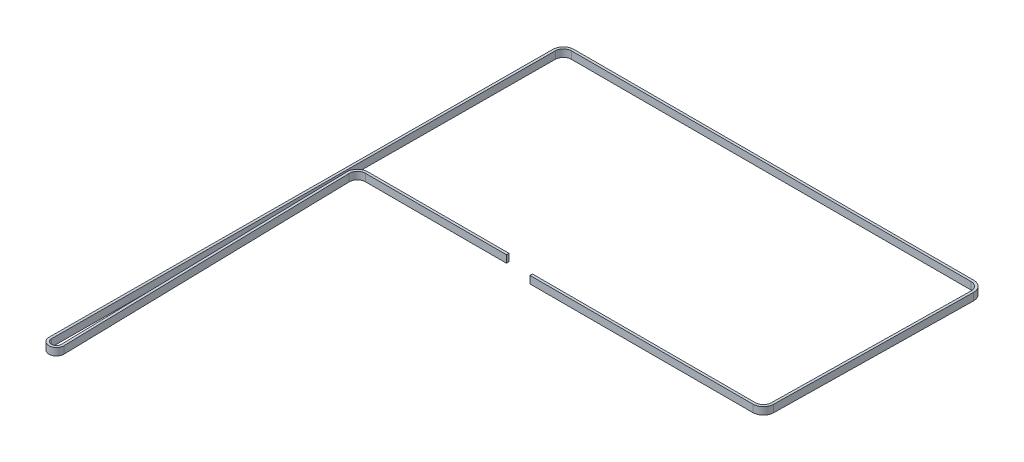
ISO-10303-21;
HEADER;
FILE_DESCRIPTION(('STEP AP214'),'2;1');
FILE_NAME('part.step','',(''),(''),'','','');
FILE_SCHEMA(('AUTOMOTIVE_DESIGN { 1 0 10303 214 1 1 1 1 }'));
ENDSEC;
DATA;
#1=APPLICATION_CONTEXT('core data for automotive mechanical design processes');
#2=APPLICATION_PROTOCOL_DEFINITION('international standard','automotive_design',2000,#1);
#3=PRODUCT_CONTEXT('',#1,'mechanical');
#4=PRODUCT('Part','Part','',(#3));
#5=PRODUCT_RELATED_PRODUCT_CATEGORY('part','',(#4));
#6=PRODUCT_DEFINITION_FORMATION('','',#4);
#7=PRODUCT_DEFINITION_CONTEXT('part definition',#1,'design');
#8=PRODUCT_DEFINITION('design','',#6,#7);
#9=PRODUCT_DEFINITION_SHAPE('','',#8);
#10=(LENGTH_UNIT() NAMED_UNIT(*) SI_UNIT(.MILLI.,.METRE.));
#11=(NAMED_UNIT(*) PLANE_ANGLE_UNIT() SI_UNIT($,.RADIAN.));
#12=(NAMED_UNIT(*) SI_UNIT($,.STERADIAN.) SOLID_ANGLE_UNIT());
#13=UNCERTAINTY_MEASURE_WITH_UNIT(LENGTH_MEASURE(1.E-05),#10,'distance_accuracy_value','');
#14=(GEOMETRIC_REPRESENTATION_CONTEXT(3) GLOBAL_UNCERTAINTY_ASSIGNED_CONTEXT((#13)) GLOBAL_UNIT_ASSIGNED_CONTEXT((#10,
#11,#12)) REPRESENTATION_CONTEXT('',''));
#15=CARTESIAN_POINT('',(0.,0.,0.));
#16=DIRECTION('',(0.,0.,1.));
#17=DIRECTION('',(1.,0.,0.));
#18=AXIS2_PLACEMENT_3D('',#15,#16,#17);
#19=CARTESIAN_POINT('',(159.500009042404,500.,-17.0773660537626));
#20=DIRECTION('',(0.,0.,-1.));
#21=DIRECTION('',(0.,1.,0.));
#22=AXIS2_PLACEMENT_3D('',#19,#20,#21);
#23=PLANE('',#22);
#24=DIRECTION('',(-1.,0.,0.));
#25=VECTOR('',#24,1.);
#26=CARTESIAN_POINT('',(159.500009042404,506.,-17.0773660537626));
#27=LINE('',#26,#25);
#28=CARTESIAN_POINT('',(159.500009042404,506.,-17.0773660537626));
#29=VERTEX_POINT('',#28);
#30=CARTESIAN_POINT('',(-21.1924852746072,506.,-17.0773660537626));
#31=VERTEX_POINT('',#30);
#32=EDGE_CURVE('E224',#29,#31,#27,.T.);
#33=ORIENTED_EDGE('',*,*,#32,.T.);
#34=DIRECTION('',(0.,1.,0.));
#35=VECTOR('',#34,1.);
#36=CARTESIAN_POINT('',(-21.1924852746072,500.,-17.0773660537626));
#37=LINE('',#36,#35);
#38=CARTESIAN_POINT('',(-21.1924852746072,500.,-17.0773660537626));
#39=VERTEX_POINT('',#38);
#40=EDGE_CURVE('E11',#39,#31,#37,.T.);
#41=ORIENTED_EDGE('',*,*,#40,.F.);
#42=DIRECTION('',(-1.,0.,0.));
#43=VECTOR('',#42,1.);
#44=CARTESIAN_POINT('',(159.500009042404,500.,-17.0773660537626));
#45=LINE('',#44,#43);
#46=CARTESIAN_POINT('',(159.500009042404,500.,-17.0773660537626));
#47=VERTEX_POINT('',#46);
#48=EDGE_CURVE('E137',#47,#39,#45,.T.);
#49=ORIENTED_EDGE('',*,*,#48,.F.);
#50=DIRECTION('',(0.,1.,0.));
#51=VECTOR('',#50,1.);
#52=CARTESIAN_POINT('',(159.500009042404,500.,-17.0773660537626));
#53=LINE('',#52,#51);
#54=EDGE_CURVE('E220',#47,#29,#53,.T.);
#55=ORIENTED_EDGE('',*,*,#54,.T.);
#56=EDGE_LOOP('',(#33,#41,#49,#55));
#57=FACE_BOUND('',#56,.T.);
#58=ADVANCED_FACE('F33',(#57),#23,.F.);
#59=CARTESIAN_POINT('',(-21.1924852746072,500.,-19.0773660537626));
#60=DIRECTION('',(-1.,0.,0.));
#61=DIRECTION('',(0.,0.,1.));
#62=AXIS2_PLACEMENT_3D('',#59,#60,#61);
#63=PLANE('',#62);
#64=DIRECTION('',(0.,0.,1.));
#65=VECTOR('',#64,1.);
#66=CARTESIAN_POINT('',(-21.1924852746072,506.,-19.0773660537626));
#67=LINE('',#66,#65);
#68=CARTESIAN_POINT('',(-21.1924852746072,506.,-19.0773660537626));
#69=VERTEX_POINT('',#68);
#70=EDGE_CURVE('E227',#69,#31,#67,.T.);
#71=ORIENTED_EDGE('',*,*,#70,.F.);
#72=DIRECTION('',(0.,1.,0.));
#73=VECTOR('',#72,1.);
#74=CARTESIAN_POINT('',(-21.1924852746072,500.,-19.0773660537626));
#75=LINE('',#74,#73);
#76=CARTESIAN_POINT('',(-21.1924852746072,500.,-19.0773660537626));
#77=VERTEX_POINT('',#76);
#78=EDGE_CURVE('E41',#77,#69,#75,.T.);
#79=ORIENTED_EDGE('',*,*,#78,.F.);
#80=DIRECTION('',(0.,0.,1.));
#81=VECTOR('',#80,1.);
#82=CARTESIAN_POINT('',(-21.1924852746072,500.,-19.0773660537626));
#83=LINE('',#82,#81);
#84=EDGE_CURVE('E349',#77,#39,#83,.T.);
#85=ORIENTED_EDGE('',*,*,#84,.T.);
#86=ORIENTED_EDGE('',*,*,#40,.T.);
#87=EDGE_LOOP('',(#71,#79,#85,#86));
#88=FACE_BOUND('',#87,.T.);
#89=ADVANCED_FACE('F336',(#88),#63,.T.);
#90=CARTESIAN_POINT('',(159.500009042404,500.,-19.0773660537626));
#91=DIRECTION('',(0.,0.,-1.));
#92=DIRECTION('',(0.,1.,0.));
#93=AXIS2_PLACEMENT_3D('',#90,#91,#92);
#94=PLANE('',#93);
#95=DIRECTION('',(-1.,0.,0.));
#96=VECTOR('',#95,1.);
#97=CARTESIAN_POINT('',(159.500009042404,506.,-19.0773660537626));
#98=LINE('',#97,#96);
#99=CARTESIAN_POINT('',(159.500009042404,506.,-19.0773660537626));
#100=VERTEX_POINT('',#99);
#101=EDGE_CURVE('E230',#100,#69,#98,.T.);
#102=ORIENTED_EDGE('',*,*,#101,.F.);
#103=DIRECTION('',(0.,1.,0.));
#104=VECTOR('',#103,1.);
#105=CARTESIAN_POINT('',(159.500009042404,500.,-19.0773660537626));
#106=LINE('',#105,#104);
#107=CARTESIAN_POINT('',(159.500009042404,500.,-19.0773660537626));
#108=VERTEX_POINT('',#107);
#109=EDGE_CURVE('E326',#108,#100,#106,.T.);
#110=ORIENTED_EDGE('',*,*,#109,.F.);
#111=DIRECTION('',(-1.,0.,0.));
#112=VECTOR('',#111,1.);
#113=CARTESIAN_POINT('',(159.500009042404,500.,-19.0773660537626));
#114=LINE('',#113,#112);
#115=EDGE_CURVE('E333',#108,#77,#114,.T.);
#116=ORIENTED_EDGE('',*,*,#115,.T.);
#117=ORIENTED_EDGE('',*,*,#78,.T.);
#118=EDGE_LOOP('',(#102,#110,#116,#117));
#119=FACE_BOUND('',#118,.T.);
#120=ADVANCED_FACE('F331',(#119),#94,.T.);
#121=CARTESIAN_POINT('',(159.500009042404,500.,-25.5773660537626));
#122=DIRECTION('',(0.,1.,0.));
#123=DIRECTION('',(-1.,0.,0.));
#124=AXIS2_PLACEMENT_3D('',#121,#122,#123);
#125=CYLINDRICAL_SURFACE('',#124,6.50000000000001);
#126=CARTESIAN_POINT('',(159.500009042404,506.,-25.5773660537626));
#127=DIRECTION('',(0.,-1.,0.));
#128=DIRECTION('',(1.,0.,0.));
#129=AXIS2_PLACEMENT_3D('',#126,#127,#128);
#130=CIRCLE('',#129,6.50000000000001);
#131=CARTESIAN_POINT('',(165.999209980939,506.,-25.4754486335334));
#132=VERTEX_POINT('',#131);
#133=EDGE_CURVE('E233',#132,#100,#130,.T.);
#134=ORIENTED_EDGE('',*,*,#133,.F.);
#135=DIRECTION('',(0.,1.,0.));
#136=VECTOR('',#135,1.);
#137=CARTESIAN_POINT('',(165.999209980939,500.,-25.4754486335335));
#138=LINE('',#137,#136);
#139=CARTESIAN_POINT('',(165.999209980939,500.,-25.4754486335335));
#140=VERTEX_POINT('',#139);
#141=EDGE_CURVE('E324',#140,#132,#138,.T.);
#142=ORIENTED_EDGE('',*,*,#141,.F.);
#143=CARTESIAN_POINT('',(159.500009042404,500.,-25.5773660537626));
#144=DIRECTION('',(0.,-1.,0.));
#145=DIRECTION('',(1.,0.,0.));
#146=AXIS2_PLACEMENT_3D('',#143,#144,#145);
#147=CIRCLE('',#146,6.50000000000001);
#148=EDGE_CURVE('E346',#140,#108,#147,.T.);
#149=ORIENTED_EDGE('',*,*,#148,.T.);
#150=ORIENTED_EDGE('',*,*,#109,.T.);
#151=EDGE_LOOP('',(#134,#142,#149,#150));
#152=FACE_BOUND('',#151,.T.);
#153=ADVANCED_FACE('F343',(#152),#125,.F.);
#154=CARTESIAN_POINT('',(168.499200930835,500.,-184.898082088762));
#155=DIRECTION('',(-0.999877067466918,0.,-0.0156796031121782));
#156=DIRECTION('',(-0.0156796031121782,0.,0.999877067466919));
#157=AXIS2_PLACEMENT_3D('',#154,#155,#156);
#158=PLANE('',#157);
#159=DIRECTION('',(-0.0156796031121782,0.,0.999877067466919));
#160=VECTOR('',#159,1.);
#161=CARTESIAN_POINT('',(168.499200930835,506.,-184.898082088762));
#162=LINE('',#161,#160);
#163=CARTESIAN_POINT('',(168.499200930835,506.,-184.898082088762));
#164=VERTEX_POINT('',#163);
#165=EDGE_CURVE('E236',#164,#132,#162,.T.);
#166=ORIENTED_EDGE('',*,*,#165,.F.);
#167=DIRECTION('',(0.,1.,0.));
#168=VECTOR('',#167,1.);
#169=CARTESIAN_POINT('',(168.499200930835,500.,-184.898082088762));
#170=LINE('',#169,#168);
#171=CARTESIAN_POINT('',(168.499200930835,500.,-184.898082088762));
#172=VERTEX_POINT('',#171);
#173=EDGE_CURVE('E322',#172,#164,#170,.T.);
#174=ORIENTED_EDGE('',*,*,#173,.F.);
#175=DIRECTION('',(-0.0156796031121782,0.,0.999877067466919));
#176=VECTOR('',#175,1.);
#177=CARTESIAN_POINT('',(168.499200930835,500.,-184.898082088762));
#178=LINE('',#177,#176);
#179=EDGE_CURVE('E351',#172,#140,#178,.T.);
#180=ORIENTED_EDGE('',*,*,#179,.T.);
#181=ORIENTED_EDGE('',*,*,#141,.T.);
#182=EDGE_LOOP('',(#166,#174,#180,#181));
#183=FACE_BOUND('',#182,.T.);
#184=ADVANCED_FACE('F427',(#183),#158,.T.);
#185=CARTESIAN_POINT('',(162.,500.,-185.));
#186=DIRECTION('',(0.,1.,0.));
#187=DIRECTION('',(-1.,0.,0.));
#188=AXIS2_PLACEMENT_3D('',#185,#186,#187);
#189=CYLINDRICAL_SURFACE('',#188,6.49999999999997);
#190=CARTESIAN_POINT('',(162.,506.,-185.));
#191=DIRECTION('',(0.,-1.,0.));
#192=DIRECTION('',(1.,0.,0.));
#193=AXIS2_PLACEMENT_3D('',#190,#191,#192);
#194=CIRCLE('',#193,6.49999999999997);
#195=CARTESIAN_POINT('',(162.,506.,-191.5));
#196=VERTEX_POINT('',#195);
#197=EDGE_CURVE('E239',#196,#164,#194,.T.);
#198=ORIENTED_EDGE('',*,*,#197,.F.);
#199=DIRECTION('',(0.,1.,0.));
#200=VECTOR('',#199,1.);
#201=CARTESIAN_POINT('',(162.,500.,-191.5));
#202=LINE('',#201,#200);
#203=CARTESIAN_POINT('',(162.,500.,-191.5));
#204=VERTEX_POINT('',#203);
#205=EDGE_CURVE('E320',#204,#196,#202,.T.);
#206=ORIENTED_EDGE('',*,*,#205,.F.);
#207=CARTESIAN_POINT('',(162.,500.,-185.));
#208=DIRECTION('',(0.,-1.,0.));
#209=DIRECTION('',(1.,0.,0.));
#210=AXIS2_PLACEMENT_3D('',#207,#208,#209);
#211=CIRCLE('',#210,6.49999999999997);
#212=EDGE_CURVE('E357',#204,#172,#211,.T.);
#213=ORIENTED_EDGE('',*,*,#212,.T.);
#214=ORIENTED_EDGE('',*,*,#173,.T.);
#215=EDGE_LOOP('',(#198,#206,#213,#214));
#216=FACE_BOUND('',#215,.T.);
#217=ADVANCED_FACE('F430',(#216),#189,.F.);
#218=CARTESIAN_POINT('',(-162.,500.,-191.5));
#219=DIRECTION('',(0.,0.,1.));
#220=DIRECTION('',(0.,-1.,0.));
#221=AXIS2_PLACEMENT_3D('',#218,#219,#220);
#222=PLANE('',#221);
#223=DIRECTION('',(1.,0.,0.));
#224=VECTOR('',#223,1.);
#225=CARTESIAN_POINT('',(-162.,506.,-191.5));
#226=LINE('',#225,#224);
#227=CARTESIAN_POINT('',(-162.,506.,-191.5));
#228=VERTEX_POINT('',#227);
#229=EDGE_CURVE('E242',#228,#196,#226,.T.);
#230=ORIENTED_EDGE('',*,*,#229,.F.);
#231=DIRECTION('',(0.,1.,0.));
#232=VECTOR('',#231,1.);
#233=CARTESIAN_POINT('',(-162.,500.,-191.5));
#234=LINE('',#233,#232);
#235=CARTESIAN_POINT('',(-162.,500.,-191.5));
#236=VERTEX_POINT('',#235);
#237=EDGE_CURVE('E318',#236,#228,#234,.T.);
#238=ORIENTED_EDGE('',*,*,#237,.F.);
#239=DIRECTION('',(1.,0.,0.));
#240=VECTOR('',#239,1.);
#241=CARTESIAN_POINT('',(-162.,500.,-191.5));
#242=LINE('',#241,#240);
#243=EDGE_CURVE('E360',#236,#204,#242,.T.);
#244=ORIENTED_EDGE('',*,*,#243,.T.);
#245=ORIENTED_EDGE('',*,*,#205,.T.);
#246=EDGE_LOOP('',(#230,#238,#244,#245));
#247=FACE_BOUND('',#246,.T.);
#248=ADVANCED_FACE('F434',(#247),#222,.T.);
#249=CARTESIAN_POINT('',(-162.,500.,-185.));
#250=DIRECTION('',(0.,1.,0.));
#251=DIRECTION('',(-1.,0.,0.));
#252=AXIS2_PLACEMENT_3D('',#249,#250,#251);
#253=CYLINDRICAL_SURFACE('',#252,6.49999999999976);
#254=CARTESIAN_POINT('',(-162.,506.,-185.));
#255=DIRECTION('',(0.,-1.,0.));
#256=DIRECTION('',(1.,0.,0.));
#257=AXIS2_PLACEMENT_3D('',#254,#255,#256);
#258=CIRCLE('',#257,6.49999999999976);
#259=CARTESIAN_POINT('',(-168.499908932358,506.,-185.034407427147));
#260=VERTEX_POINT('',#259);
#261=EDGE_CURVE('E245',#260,#228,#258,.T.);
#262=ORIENTED_EDGE('',*,*,#261,.F.);
#263=DIRECTION('',(0.,1.,0.));
#264=VECTOR('',#263,1.);
#265=CARTESIAN_POINT('',(-168.499908932358,500.,-185.034407427147));
#266=LINE('',#265,#264);
#267=CARTESIAN_POINT('',(-168.499908932358,500.,-185.034407427147));
#268=VERTEX_POINT('',#267);
#269=EDGE_CURVE('E316',#268,#260,#266,.T.);
#270=ORIENTED_EDGE('',*,*,#269,.F.);
#271=CARTESIAN_POINT('',(-162.,500.,-185.));
#272=DIRECTION('',(0.,-1.,0.));
#273=DIRECTION('',(1.,0.,0.));
#274=AXIS2_PLACEMENT_3D('',#271,#272,#273);
#275=CIRCLE('',#274,6.49999999999976);
#276=EDGE_CURVE('E363',#268,#236,#275,.T.);
#277=ORIENTED_EDGE('',*,*,#276,.T.);
#278=ORIENTED_EDGE('',*,*,#237,.T.);
#279=EDGE_LOOP('',(#262,#270,#277,#278));
#280=FACE_BOUND('',#279,.T.);
#281=ADVANCED_FACE('F438',(#280),#253,.F.);
#282=CARTESIAN_POINT('',(-170.649943958374,500.,221.128826198679));
#283=DIRECTION('',(0.999985989593655,0.,0.00529345033019993));
#284=DIRECTION('',(0.00529345033019993,0.,-0.999985989593655));
#285=AXIS2_PLACEMENT_3D('',#282,#283,#284);
#286=PLANE('',#285);
#287=DIRECTION('',(0.00529345033019993,0.,-0.999985989593655));
#288=VECTOR('',#287,1.);
#289=CARTESIAN_POINT('',(-170.649943958374,506.,221.128826198679));
#290=LINE('',#289,#288);
#291=CARTESIAN_POINT('',(-170.649943958374,506.,221.128826198679));
#292=VERTEX_POINT('',#291);
#293=EDGE_CURVE('E248',#292,#260,#290,.T.);
#294=ORIENTED_EDGE('',*,*,#293,.F.);
#295=DIRECTION('',(0.,1.,0.));
#296=VECTOR('',#295,1.);
#297=CARTESIAN_POINT('',(-170.649943958374,500.,221.128826198679));
#298=LINE('',#297,#296);
#299=CARTESIAN_POINT('',(-170.649943958374,500.,221.128826198679));
#300=VERTEX_POINT('',#299);
#301=EDGE_CURVE('E314',#300,#292,#298,.T.);
#302=ORIENTED_EDGE('',*,*,#301,.F.);
#303=DIRECTION('',(0.00529345033019993,0.,-0.999985989593655));
#304=VECTOR('',#303,1.);
#305=CARTESIAN_POINT('',(-170.649943958374,500.,221.128826198679));
#306=LINE('',#305,#304);
#307=EDGE_CURVE('E366',#300,#268,#306,.T.);
#308=ORIENTED_EDGE('',*,*,#307,.T.);
#309=ORIENTED_EDGE('',*,*,#269,.T.);
#310=EDGE_LOOP('',(#294,#302,#308,#309));
#311=FACE_BOUND('',#310,.T.);
#312=ADVANCED_FACE('F442',(#311),#286,.T.);
#313=CARTESIAN_POINT('',(-166.65,500.,221.15));
#314=DIRECTION('',(0.,1.,0.));
#315=DIRECTION('',(-1.,0.,0.));
#316=AXIS2_PLACEMENT_3D('',#313,#314,#315);
#317=CYLINDRICAL_SURFACE('',#316,3.99999999999997);
#318=CARTESIAN_POINT('',(-166.65,506.,221.15));
#319=DIRECTION('',(0.,-1.,0.));
#320=DIRECTION('',(1.,0.,0.));
#321=AXIS2_PLACEMENT_3D('',#318,#319,#320);
#322=CIRCLE('',#321,3.99999999999997);
#323=CARTESIAN_POINT('',(-162.651022333835,506.,221.059569775444));
#324=VERTEX_POINT('',#323);
#325=EDGE_CURVE('E251',#324,#292,#322,.T.);
#326=ORIENTED_EDGE('',*,*,#325,.F.);
#327=DIRECTION('',(0.,1.,0.));
#328=VECTOR('',#327,1.);
#329=CARTESIAN_POINT('',(-162.651022333835,500.,221.059569775444));
#330=LINE('',#329,#328);
#331=CARTESIAN_POINT('',(-162.651022333835,500.,221.059569775444));
#332=VERTEX_POINT('',#331);
#333=EDGE_CURVE('E312',#332,#324,#330,.T.);
#334=ORIENTED_EDGE('',*,*,#333,.F.);
#335=CARTESIAN_POINT('',(-166.65,500.,221.15));
#336=DIRECTION('',(0.,-1.,0.));
#337=DIRECTION('',(1.,0.,0.));
#338=AXIS2_PLACEMENT_3D('',#335,#336,#337);
#339=CIRCLE('',#338,3.99999999999997);
#340=EDGE_CURVE('E369',#332,#300,#339,.T.);
#341=ORIENTED_EDGE('',*,*,#340,.T.);
#342=ORIENTED_EDGE('',*,*,#301,.T.);
#343=EDGE_LOOP('',(#326,#334,#341,#342));
#344=FACE_BOUND('',#343,.T.);
#345=ADVANCED_FACE('F446',(#344),#317,.F.);
#346=CARTESIAN_POINT('',(-162.651022333835,500.,221.059569775444));
#347=DIRECTION('',(-0.999744416541259,0.,0.0226075561389632));
#348=DIRECTION('',(0.0226075561389632,0.,0.99974441654126));
#349=AXIS2_PLACEMENT_3D('',#346,#347,#348);
#350=PLANE('',#349);
#351=DIRECTION('',(0.0226075561389632,0.,0.99974441654126));
#352=VECTOR('',#351,1.);
#353=CARTESIAN_POINT('',(-162.651022333835,506.,221.059569775444));
#354=LINE('',#353,#352);
#355=CARTESIAN_POINT('',(-167.997827541002,506.,-15.3852108696652));
#356=VERTEX_POINT('',#355);
#357=EDGE_CURVE('E254',#356,#324,#354,.T.);
#358=ORIENTED_EDGE('',*,*,#357,.F.);
#359=DIRECTION('',(0.,1.,0.));
#360=VECTOR('',#359,1.);
#361=CARTESIAN_POINT('',(-167.997827541002,500.,-15.3852108696652));
#362=LINE('',#361,#360);
#363=CARTESIAN_POINT('',(-167.997827541002,500.,-15.3852108696652));
#364=VERTEX_POINT('',#363);
#365=EDGE_CURVE('E310',#364,#356,#362,.T.);
#366=ORIENTED_EDGE('',*,*,#365,.F.);
#367=DIRECTION('',(0.0226075561389632,0.,0.99974441654126));
#368=VECTOR('',#367,1.);
#369=CARTESIAN_POINT('',(-162.651022333835,500.,221.059569775444));
#370=LINE('',#369,#368);
#371=EDGE_CURVE('E372',#364,#332,#370,.T.);
#372=ORIENTED_EDGE('',*,*,#371,.T.);
#373=ORIENTED_EDGE('',*,*,#333,.T.);
#374=EDGE_LOOP('',(#358,#366,#372,#373));
#375=FACE_BOUND('',#374,.T.);
#376=ADVANCED_FACE('F450',(#375),#350,.T.);
#377=CARTESIAN_POINT('',(-159.500000904101,500.,-15.5773760009469));
#378=DIRECTION('',(0.,1.,0.));
#379=DIRECTION('',(-1.,0.,0.));
#380=AXIS2_PLACEMENT_3D('',#377,#378,#379);
#381=CYLINDRICAL_SURFACE('',#380,8.49999910643548);
#382=CARTESIAN_POINT('',(-159.500000904101,506.,-15.5773760009468));
#383=DIRECTION('',(0.,-1.,0.));
#384=DIRECTION('',(1.,0.,0.));
#385=AXIS2_PLACEMENT_3D('',#382,#383,#384);
#386=CIRCLE('',#385,8.49999910643548);
#387=CARTESIAN_POINT('',(-159.49999972234,506.,-24.0773751073822));
#388=VERTEX_POINT('',#387);
#389=EDGE_CURVE('E257',#388,#356,#386,.F.);
#390=ORIENTED_EDGE('',*,*,#389,.F.);
#391=DIRECTION('',(0.,1.,0.));
#392=VECTOR('',#391,1.);
#393=CARTESIAN_POINT('',(-159.49999972234,500.,-24.0773751073822));
#394=LINE('',#393,#392);
#395=CARTESIAN_POINT('',(-159.49999972234,500.,-24.0773751073822));
#396=VERTEX_POINT('',#395);
#397=EDGE_CURVE('E308',#396,#388,#394,.T.);
#398=ORIENTED_EDGE('',*,*,#397,.F.);
#399=CARTESIAN_POINT('',(-159.500000904101,500.,-15.5773760009469));
#400=DIRECTION('',(0.,-1.,0.));
#401=DIRECTION('',(1.,0.,0.));
#402=AXIS2_PLACEMENT_3D('',#399,#400,#401);
#403=CIRCLE('',#402,8.49999910643548);
#404=EDGE_CURVE('E375',#396,#364,#403,.F.);
#405=ORIENTED_EDGE('',*,*,#404,.T.);
#406=ORIENTED_EDGE('',*,*,#365,.T.);
#407=EDGE_LOOP('',(#390,#398,#405,#406));
#408=FACE_BOUND('',#407,.T.);
#409=ADVANCED_FACE('F454',(#408),#381,.T.);
#410=CARTESIAN_POINT('',(-159.500000000401,500.,-24.0773750968464));
#411=DIRECTION('',(0.,0.,-1.));
#412=DIRECTION('',(0.,1.,0.));
#413=AXIS2_PLACEMENT_3D('',#410,#411,#412);
#414=PLANE('',#413);
#415=DIRECTION('',(-1.,0.,0.));
#416=VECTOR('',#415,1.);
#417=CARTESIAN_POINT('',(-159.500000000401,506.,-24.0773750968464));
#418=LINE('',#417,#416);
#419=CARTESIAN_POINT('',(-45.1924852746072,506.,-24.0773750968464));
#420=VERTEX_POINT('',#419);
#421=EDGE_CURVE('E260',#420,#388,#418,.T.);
#422=ORIENTED_EDGE('',*,*,#421,.F.);
#423=DIRECTION('',(0.,1.,0.));
#424=VECTOR('',#423,1.);
#425=CARTESIAN_POINT('',(-45.1924852746072,500.,-24.0773750968464));
#426=LINE('',#425,#424);
#427=CARTESIAN_POINT('',(-45.1924852746072,500.,-24.0773750968464));
#428=VERTEX_POINT('',#427);
#429=EDGE_CURVE('E306',#428,#420,#426,.T.);
#430=ORIENTED_EDGE('',*,*,#429,.F.);
#431=DIRECTION('',(-1.,0.,0.));
#432=VECTOR('',#431,1.);
#433=CARTESIAN_POINT('',(-159.500000000401,500.,-24.0773750968464));
#434=LINE('',#433,#432);
#435=EDGE_CURVE('E378',#428,#396,#434,.T.);
#436=ORIENTED_EDGE('',*,*,#435,.T.);
#437=ORIENTED_EDGE('',*,*,#397,.T.);
#438=EDGE_LOOP('',(#422,#430,#436,#437));
#439=FACE_BOUND('',#438,.T.);
#440=ADVANCED_FACE('F458',(#439),#414,.T.);
#441=CARTESIAN_POINT('',(-45.1924852746072,500.,-22.0773750968464));
#442=DIRECTION('',(1.,0.,0.));
#443=DIRECTION('',(0.,1.,0.));
#444=AXIS2_PLACEMENT_3D('',#441,#442,#443);
#445=PLANE('',#444);
#446=DIRECTION('',(0.,0.,-1.));
#447=VECTOR('',#446,1.);
#448=CARTESIAN_POINT('',(-45.1924852746072,506.,-22.0773750968464));
#449=LINE('',#448,#447);
#450=CARTESIAN_POINT('',(-45.1924852746072,506.,-22.0773750968464));
#451=VERTEX_POINT('',#450);
#452=EDGE_CURVE('E263',#451,#420,#449,.T.);
#453=ORIENTED_EDGE('',*,*,#452,.F.);
#454=DIRECTION('',(0.,1.,0.));
#455=VECTOR('',#454,1.);
#456=CARTESIAN_POINT('',(-45.1924852746072,500.,-22.0773750968464));
#457=LINE('',#456,#455);
#458=CARTESIAN_POINT('',(-45.1924852746072,500.,-22.0773750968464));
#459=VERTEX_POINT('',#458);
#460=EDGE_CURVE('E304',#459,#451,#457,.T.);
#461=ORIENTED_EDGE('',*,*,#460,.F.);
#462=DIRECTION('',(0.,0.,-1.));
#463=VECTOR('',#462,1.);
#464=CARTESIAN_POINT('',(-45.1924852746072,500.,-22.0773750968464));
#465=LINE('',#464,#463);
#466=EDGE_CURVE('E381',#459,#428,#465,.T.);
#467=ORIENTED_EDGE('',*,*,#466,.T.);
#468=ORIENTED_EDGE('',*,*,#429,.T.);
#469=EDGE_LOOP('',(#453,#461,#467,#468));
#470=FACE_BOUND('',#469,.T.);
#471=ADVANCED_FACE('F462',(#470),#445,.T.);
#472=CARTESIAN_POINT('',(-159.500000000401,500.,-22.0773750968464));
#473=DIRECTION('',(0.,0.,-1.));
#474=DIRECTION('',(0.,1.,0.));
#475=AXIS2_PLACEMENT_3D('',#472,#473,#474);
#476=PLANE('',#475);
#477=DIRECTION('',(-1.,0.,0.));
#478=VECTOR('',#477,1.);
#479=CARTESIAN_POINT('',(-159.500000000401,506.,-22.0773750968464));
#480=LINE('',#479,#478);
#481=CARTESIAN_POINT('',(-159.500000000401,506.,-22.0773750968464));
#482=VERTEX_POINT('',#481);
#483=EDGE_CURVE('E266',#451,#482,#480,.T.);
#484=ORIENTED_EDGE('',*,*,#483,.T.);
#485=DIRECTION('',(0.,1.,0.));
#486=VECTOR('',#485,1.);
#487=CARTESIAN_POINT('',(-159.500000000401,500.,-22.0773750968464));
#488=LINE('',#487,#486);
#489=CARTESIAN_POINT('',(-159.500000000401,500.,-22.0773750968464));
#490=VERTEX_POINT('',#489);
#491=EDGE_CURVE('E301',#490,#482,#488,.T.);
#492=ORIENTED_EDGE('',*,*,#491,.F.);
#493=DIRECTION('',(-1.,0.,0.));
#494=VECTOR('',#493,1.);
#495=CARTESIAN_POINT('',(-159.500000000401,500.,-22.0773750968464));
#496=LINE('',#495,#494);
#497=EDGE_CURVE('E384',#459,#490,#496,.T.);
#498=ORIENTED_EDGE('',*,*,#497,.F.);
#499=ORIENTED_EDGE('',*,*,#460,.T.);
#500=EDGE_LOOP('',(#484,#492,#498,#499));
#501=FACE_BOUND('',#500,.T.);
#502=ADVANCED_FACE('F466',(#501),#476,.F.);
#503=CARTESIAN_POINT('',(-159.500000904101,500.,-15.5773760009469));
#504=DIRECTION('',(0.,1.,0.));
#505=DIRECTION('',(-1.,0.,0.));
#506=AXIS2_PLACEMENT_3D('',#503,#504,#505);
#507=CYLINDRICAL_SURFACE('',#506,6.49999910643548);
#508=CARTESIAN_POINT('',(-159.500000904101,506.,-15.5773760009468));
#509=DIRECTION('',(0.,1.,0.));
#510=DIRECTION('',(1.,0.,0.));
#511=AXIS2_PLACEMENT_3D('',#508,#509,#510);
#512=CIRCLE('',#511,6.49999910643548);
#513=CARTESIAN_POINT('',(-165.998338697386,506.,-15.4304259821813));
#514=VERTEX_POINT('',#513);
#515=EDGE_CURVE('E268',#482,#514,#512,.T.);
#516=ORIENTED_EDGE('',*,*,#515,.T.);
#517=DIRECTION('',(0.,1.,0.));
#518=VECTOR('',#517,1.);
#519=CARTESIAN_POINT('',(-165.998338697386,500.,-15.4304259821813));
#520=LINE('',#519,#518);
#521=CARTESIAN_POINT('',(-165.998338697386,500.,-15.4304259821813));
#522=VERTEX_POINT('',#521);
#523=EDGE_CURVE('E298',#522,#514,#520,.T.);
#524=ORIENTED_EDGE('',*,*,#523,.F.);
#525=CARTESIAN_POINT('',(-159.500000904101,500.,-15.5773760009469));
#526=DIRECTION('',(0.,1.,0.));
#527=DIRECTION('',(1.,0.,0.));
#528=AXIS2_PLACEMENT_3D('',#525,#526,#527);
#529=CIRCLE('',#528,6.49999910643548);
#530=EDGE_CURVE('E386',#490,#522,#529,.T.);
#531=ORIENTED_EDGE('',*,*,#530,.F.);
#532=ORIENTED_EDGE('',*,*,#491,.T.);
#533=EDGE_LOOP('',(#516,#524,#531,#532));
#534=FACE_BOUND('',#533,.T.);
#535=ADVANCED_FACE('F470',(#534),#507,.F.);
#536=CARTESIAN_POINT('',(-160.651533500752,500.,221.014354663166));
#537=DIRECTION('',(-0.99974441654126,0.,0.0226075561389632));
#538=DIRECTION('',(0.0226075561389632,0.,0.99974441654126));
#539=AXIS2_PLACEMENT_3D('',#536,#537,#538);
#540=PLANE('',#539);
#541=DIRECTION('',(0.0226075561389632,0.,0.99974441654126));
#542=VECTOR('',#541,1.);
#543=CARTESIAN_POINT('',(-160.651533500752,506.,221.014354663166));
#544=LINE('',#543,#542);
#545=CARTESIAN_POINT('',(-160.651533500752,506.,221.014354663166));
#546=VERTEX_POINT('',#545);
#547=EDGE_CURVE('E270',#514,#546,#544,.T.);
#548=ORIENTED_EDGE('',*,*,#547,.T.);
#549=DIRECTION('',(0.,1.,0.));
#550=VECTOR('',#549,1.);
#551=CARTESIAN_POINT('',(-160.651533500752,500.,221.014354663166));
#552=LINE('',#551,#550);
#553=CARTESIAN_POINT('',(-160.651533500752,500.,221.014354663166));
#554=VERTEX_POINT('',#553);
#555=EDGE_CURVE('E295',#554,#546,#552,.T.);
#556=ORIENTED_EDGE('',*,*,#555,.F.);
#557=DIRECTION('',(0.0226075561389632,0.,0.99974441654126));
#558=VECTOR('',#557,1.);
#559=CARTESIAN_POINT('',(-160.651533500752,500.,221.014354663166));
#560=LINE('',#559,#558);
#561=EDGE_CURVE('E388',#522,#554,#560,.T.);
#562=ORIENTED_EDGE('',*,*,#561,.F.);
#563=ORIENTED_EDGE('',*,*,#523,.T.);
#564=EDGE_LOOP('',(#548,#556,#562,#563));
#565=FACE_BOUND('',#564,.T.);
#566=ADVANCED_FACE('F474',(#565),#540,.F.);
#567=CARTESIAN_POINT('',(-166.65,500.,221.15));
#568=DIRECTION('',(0.,1.,0.));
#569=DIRECTION('',(-1.,0.,0.));
#570=AXIS2_PLACEMENT_3D('',#567,#568,#569);
#571=CYLINDRICAL_SURFACE('',#570,5.99999999999997);
#572=CARTESIAN_POINT('',(-166.65,506.,221.15));
#573=DIRECTION('',(0.,-1.,0.));
#574=DIRECTION('',(1.,0.,0.));
#575=AXIS2_PLACEMENT_3D('',#572,#573,#574);
#576=CIRCLE('',#575,5.99999999999997);
#577=CARTESIAN_POINT('',(-172.649915937562,506.,221.118239298019));
#578=VERTEX_POINT('',#577);
#579=EDGE_CURVE('E272',#546,#578,#576,.T.);
#580=ORIENTED_EDGE('',*,*,#579,.T.);
#581=DIRECTION('',(0.,1.,0.));
#582=VECTOR('',#581,1.);
#583=CARTESIAN_POINT('',(-172.649915937562,500.,221.118239298019));
#584=LINE('',#583,#582);
#585=CARTESIAN_POINT('',(-172.649915937562,500.,221.118239298019));
#586=VERTEX_POINT('',#585);
#587=EDGE_CURVE('E292',#586,#578,#584,.T.);
#588=ORIENTED_EDGE('',*,*,#587,.F.);
#589=CARTESIAN_POINT('',(-166.65,500.,221.15));
#590=DIRECTION('',(0.,-1.,0.));
#591=DIRECTION('',(1.,0.,0.));
#592=AXIS2_PLACEMENT_3D('',#589,#590,#591);
#593=CIRCLE('',#592,5.99999999999997);
#594=EDGE_CURVE('E390',#554,#586,#593,.T.);
#595=ORIENTED_EDGE('',*,*,#594,.F.);
#596=ORIENTED_EDGE('',*,*,#555,.T.);
#597=EDGE_LOOP('',(#580,#588,#595,#596));
#598=FACE_BOUND('',#597,.T.);
#599=ADVANCED_FACE('F478',(#598),#571,.T.);
#600=CARTESIAN_POINT('',(-172.649915937562,500.,221.118239298019));
#601=DIRECTION('',(0.999985989593655,0.,0.00529345033019993));
#602=DIRECTION('',(0.00529345033019993,0.,-0.999985989593655));
#603=AXIS2_PLACEMENT_3D('',#600,#601,#602);
#604=PLANE('',#603);
#605=DIRECTION('',(0.00529345033019993,0.,-0.999985989593655));
#606=VECTOR('',#605,1.);
#607=CARTESIAN_POINT('',(-172.649915937562,506.,221.118239298019));
#608=LINE('',#607,#606);
#609=CARTESIAN_POINT('',(-170.499880911546,506.,-185.044994327808));
#610=VERTEX_POINT('',#609);
#611=EDGE_CURVE('E274',#578,#610,#608,.T.);
#612=ORIENTED_EDGE('',*,*,#611,.T.);
#613=DIRECTION('',(0.,1.,0.));
#614=VECTOR('',#613,1.);
#615=CARTESIAN_POINT('',(-170.499880911546,500.,-185.044994327808));
#616=LINE('',#615,#614);
#617=CARTESIAN_POINT('',(-170.499880911546,500.,-185.044994327808));
#618=VERTEX_POINT('',#617);
#619=EDGE_CURVE('E289',#618,#610,#616,.T.);
#620=ORIENTED_EDGE('',*,*,#619,.F.);
#621=DIRECTION('',(0.00529345033019993,0.,-0.999985989593655));
#622=VECTOR('',#621,1.);
#623=CARTESIAN_POINT('',(-172.649915937562,500.,221.118239298019));
#624=LINE('',#623,#622);
#625=EDGE_CURVE('E392',#586,#618,#624,.T.);
#626=ORIENTED_EDGE('',*,*,#625,.F.);
#627=ORIENTED_EDGE('',*,*,#587,.T.);
#628=EDGE_LOOP('',(#612,#620,#626,#627));
#629=FACE_BOUND('',#628,.T.);
#630=ADVANCED_FACE('F482',(#629),#604,.F.);
#631=CARTESIAN_POINT('',(-162.,500.,-185.));
#632=DIRECTION('',(0.,1.,0.));
#633=DIRECTION('',(-1.,0.,0.));
#634=AXIS2_PLACEMENT_3D('',#631,#632,#633);
#635=CYLINDRICAL_SURFACE('',#634,8.49999999999976);
#636=CARTESIAN_POINT('',(-162.,506.,-185.));
#637=DIRECTION('',(0.,-1.,0.));
#638=DIRECTION('',(1.,0.,0.));
#639=AXIS2_PLACEMENT_3D('',#636,#637,#638);
#640=CIRCLE('',#639,8.49999999999976);
#641=CARTESIAN_POINT('',(-162.,506.,-193.5));
#642=VERTEX_POINT('',#641);
#643=EDGE_CURVE('E276',#610,#642,#640,.T.);
#644=ORIENTED_EDGE('',*,*,#643,.T.);
#645=DIRECTION('',(0.,1.,0.));
#646=VECTOR('',#645,1.);
#647=CARTESIAN_POINT('',(-162.,500.,-193.5));
#648=LINE('',#647,#646);
#649=CARTESIAN_POINT('',(-162.,500.,-193.5));
#650=VERTEX_POINT('',#649);
#651=EDGE_CURVE('E286',#650,#642,#648,.T.);
#652=ORIENTED_EDGE('',*,*,#651,.F.);
#653=CARTESIAN_POINT('',(-162.,500.,-185.));
#654=DIRECTION('',(0.,-1.,0.));
#655=DIRECTION('',(1.,0.,0.));
#656=AXIS2_PLACEMENT_3D('',#653,#654,#655);
#657=CIRCLE('',#656,8.49999999999976);
#658=EDGE_CURVE('E394',#618,#650,#657,.T.);
#659=ORIENTED_EDGE('',*,*,#658,.F.);
#660=ORIENTED_EDGE('',*,*,#619,.T.);
#661=EDGE_LOOP('',(#644,#652,#659,#660));
#662=FACE_BOUND('',#661,.T.);
#663=ADVANCED_FACE('F400',(#662),#635,.T.);
#664=CARTESIAN_POINT('',(-162.,500.,-193.5));
#665=DIRECTION('',(0.,0.,1.));
#666=DIRECTION('',(0.,-1.,0.));
#667=AXIS2_PLACEMENT_3D('',#664,#665,#666);
#668=PLANE('',#667);
#669=DIRECTION('',(1.,0.,0.));
#670=VECTOR('',#669,1.);
#671=CARTESIAN_POINT('',(-162.,506.,-193.5));
#672=LINE('',#671,#670);
#673=CARTESIAN_POINT('',(162.,506.,-193.5));
#674=VERTEX_POINT('',#673);
#675=EDGE_CURVE('E278',#642,#674,#672,.T.);
#676=ORIENTED_EDGE('',*,*,#675,.T.);
#677=DIRECTION('',(0.,1.,0.));
#678=VECTOR('',#677,1.);
#679=CARTESIAN_POINT('',(162.,500.,-193.5));
#680=LINE('',#679,#678);
#681=CARTESIAN_POINT('',(162.,500.,-193.5));
#682=VERTEX_POINT('',#681);
#683=EDGE_CURVE('E215',#682,#674,#680,.T.);
#684=ORIENTED_EDGE('',*,*,#683,.F.);
#685=DIRECTION('',(1.,0.,0.));
#686=VECTOR('',#685,1.);
#687=CARTESIAN_POINT('',(-162.,500.,-193.5));
#688=LINE('',#687,#686);
#689=EDGE_CURVE('E206',#650,#682,#688,.T.);
#690=ORIENTED_EDGE('',*,*,#689,.F.);
#691=ORIENTED_EDGE('',*,*,#651,.T.);
#692=EDGE_LOOP('',(#676,#684,#690,#691));
#693=FACE_BOUND('',#692,.T.);
#694=ADVANCED_FACE('F404',(#693),#668,.F.);
#695=CARTESIAN_POINT('',(162.,500.,-185.));
#696=DIRECTION('',(0.,1.,0.));
#697=DIRECTION('',(-1.,0.,0.));
#698=AXIS2_PLACEMENT_3D('',#695,#696,#697);
#699=CYLINDRICAL_SURFACE('',#698,8.49999999999997);
#700=CARTESIAN_POINT('',(162.,506.,-185.));
#701=DIRECTION('',(0.,-1.,0.));
#702=DIRECTION('',(1.,0.,0.));
#703=AXIS2_PLACEMENT_3D('',#700,#701,#702);
#704=CIRCLE('',#703,8.49999999999997);
#705=CARTESIAN_POINT('',(170.498955065769,506.,-184.866722882538));
#706=VERTEX_POINT('',#705);
#707=EDGE_CURVE('E214',#674,#706,#704,.T.);
#708=ORIENTED_EDGE('',*,*,#707,.T.);
#709=DIRECTION('',(0.,1.,0.));
#710=VECTOR('',#709,1.);
#711=CARTESIAN_POINT('',(170.498955065769,500.,-184.866722882538));
#712=LINE('',#711,#710);
#713=CARTESIAN_POINT('',(170.498955065769,500.,-184.866722882538));
#714=VERTEX_POINT('',#713);
#715=EDGE_CURVE('E211',#714,#706,#712,.T.);
#716=ORIENTED_EDGE('',*,*,#715,.F.);
#717=CARTESIAN_POINT('',(162.,500.,-185.));
#718=DIRECTION('',(0.,-1.,0.));
#719=DIRECTION('',(1.,0.,0.));
#720=AXIS2_PLACEMENT_3D('',#717,#718,#719);
#721=CIRCLE('',#720,8.49999999999997);
#722=EDGE_CURVE('E200',#682,#714,#721,.T.);
#723=ORIENTED_EDGE('',*,*,#722,.F.);
#724=ORIENTED_EDGE('',*,*,#683,.T.);
#725=EDGE_LOOP('',(#708,#716,#723,#724));
#726=FACE_BOUND('',#725,.T.);
#727=ADVANCED_FACE('F212',(#726),#699,.T.);
#728=CARTESIAN_POINT('',(170.498955065769,500.,-184.866722882538));
#729=DIRECTION('',(-0.999877067466918,0.,-0.0156796031121782));
#730=DIRECTION('',(-0.0156796031121782,0.,0.999877067466919));
#731=AXIS2_PLACEMENT_3D('',#728,#729,#730);
#732=PLANE('',#731);
#733=DIRECTION('',(-0.0156796031121782,0.,0.999877067466919));
#734=VECTOR('',#733,1.);
#735=CARTESIAN_POINT('',(170.498955065769,506.,-184.866722882538));
#736=LINE('',#735,#734);
#737=CARTESIAN_POINT('',(167.998964115873,506.,-25.4440894273091));
#738=VERTEX_POINT('',#737);
#739=EDGE_CURVE('E125',#706,#738,#736,.T.);
#740=ORIENTED_EDGE('',*,*,#739,.T.);
#741=DIRECTION('',(0.,1.,0.));
#742=VECTOR('',#741,1.);
#743=CARTESIAN_POINT('',(167.998964115873,500.,-25.4440894273091));
#744=LINE('',#743,#742);
#745=CARTESIAN_POINT('',(167.998964115873,500.,-25.4440894273091));
#746=VERTEX_POINT('',#745);
#747=EDGE_CURVE('E216',#746,#738,#744,.T.);
#748=ORIENTED_EDGE('',*,*,#747,.F.);
#749=DIRECTION('',(-0.0156796031121782,0.,0.999877067466919));
#750=VECTOR('',#749,1.);
#751=CARTESIAN_POINT('',(170.498955065769,500.,-184.866722882538));
#752=LINE('',#751,#750);
#753=EDGE_CURVE('E204',#714,#746,#752,.T.);
#754=ORIENTED_EDGE('',*,*,#753,.F.);
#755=ORIENTED_EDGE('',*,*,#715,.T.);
#756=EDGE_LOOP('',(#740,#748,#754,#755));
#757=FACE_BOUND('',#756,.T.);
#758=ADVANCED_FACE('F218',(#757),#732,.F.);
#759=CARTESIAN_POINT('',(159.500009042404,500.,-25.5773660537626));
#760=DIRECTION('',(0.,1.,0.));
#761=DIRECTION('',(-1.,0.,0.));
#762=AXIS2_PLACEMENT_3D('',#759,#760,#761);
#763=CYLINDRICAL_SURFACE('',#762,8.50000000000001);
#764=CARTESIAN_POINT('',(159.500009042404,506.,-25.5773660537626));
#765=DIRECTION('',(0.,-1.,0.));
#766=DIRECTION('',(1.,0.,0.));
#767=AXIS2_PLACEMENT_3D('',#764,#765,#766);
#768=CIRCLE('',#767,8.50000000000001);
#769=EDGE_CURVE('E131',#738,#29,#768,.T.);
#770=ORIENTED_EDGE('',*,*,#769,.T.);
#771=ORIENTED_EDGE('',*,*,#54,.F.);
#772=CARTESIAN_POINT('',(159.500009042404,500.,-25.5773660537626));
#773=DIRECTION('',(0.,-1.,0.));
#774=DIRECTION('',(1.,0.,0.));
#775=AXIS2_PLACEMENT_3D('',#772,#773,#774);
#776=CIRCLE('',#775,8.50000000000001);
#777=EDGE_CURVE('E49',#746,#47,#776,.T.);
#778=ORIENTED_EDGE('',*,*,#777,.F.);
#779=ORIENTED_EDGE('',*,*,#747,.T.);
#780=EDGE_LOOP('',(#770,#771,#778,#779));
#781=FACE_BOUND('',#780,.T.);
#782=ADVANCED_FACE('F406',(#781),#763,.T.);
#783=CARTESIAN_POINT('',(159.500009042404,500.,-25.5773660537626));
#784=DIRECTION('',(0.,-1.,0.));
#785=DIRECTION('',(1.,0.,0.));
#786=AXIS2_PLACEMENT_3D('',#783,#784,#785);
#787=PLANE('',#786);
#788=ORIENTED_EDGE('',*,*,#48,.T.);
#789=ORIENTED_EDGE('',*,*,#84,.F.);
#790=ORIENTED_EDGE('',*,*,#115,.F.);
#791=ORIENTED_EDGE('',*,*,#148,.F.);
#792=ORIENTED_EDGE('',*,*,#179,.F.);
#793=ORIENTED_EDGE('',*,*,#212,.F.);
#794=ORIENTED_EDGE('',*,*,#243,.F.);
#795=ORIENTED_EDGE('',*,*,#276,.F.);
#796=ORIENTED_EDGE('',*,*,#307,.F.);
#797=ORIENTED_EDGE('',*,*,#340,.F.);
#798=ORIENTED_EDGE('',*,*,#371,.F.);
#799=ORIENTED_EDGE('',*,*,#404,.F.);
#800=ORIENTED_EDGE('',*,*,#435,.F.);
#801=ORIENTED_EDGE('',*,*,#466,.F.);
#802=ORIENTED_EDGE('',*,*,#497,.T.);
#803=ORIENTED_EDGE('',*,*,#530,.T.);
#804=ORIENTED_EDGE('',*,*,#561,.T.);
#805=ORIENTED_EDGE('',*,*,#594,.T.);
#806=ORIENTED_EDGE('',*,*,#625,.T.);
#807=ORIENTED_EDGE('',*,*,#658,.T.);
#808=ORIENTED_EDGE('',*,*,#689,.T.);
#809=ORIENTED_EDGE('',*,*,#722,.T.);
#810=ORIENTED_EDGE('',*,*,#753,.T.);
#811=ORIENTED_EDGE('',*,*,#777,.T.);
#812=EDGE_LOOP('',(#788,#789,#790,#791,#792,#793,#794,#795,#796,#797,#798,#799,#800,#801,#802,
#803,#804,#805,#806,#807,#808,#809,#810,#811));
#813=FACE_BOUND('',#812,.T.);
#814=ADVANCED_FACE('F202',(#813),#787,.T.);
#815=CARTESIAN_POINT('',(159.500009042404,506.,-25.5773660537626));
#816=DIRECTION('',(0.,-1.,0.));
#817=DIRECTION('',(1.,0.,0.));
#818=AXIS2_PLACEMENT_3D('',#815,#816,#817);
#819=PLANE('',#818);
#820=ORIENTED_EDGE('',*,*,#32,.F.);
#821=ORIENTED_EDGE('',*,*,#769,.F.);
#822=ORIENTED_EDGE('',*,*,#739,.F.);
#823=ORIENTED_EDGE('',*,*,#707,.F.);
#824=ORIENTED_EDGE('',*,*,#675,.F.);
#825=ORIENTED_EDGE('',*,*,#643,.F.);
#826=ORIENTED_EDGE('',*,*,#611,.F.);
#827=ORIENTED_EDGE('',*,*,#579,.F.);
#828=ORIENTED_EDGE('',*,*,#547,.F.);
#829=ORIENTED_EDGE('',*,*,#515,.F.);
#830=ORIENTED_EDGE('',*,*,#483,.F.);
#831=ORIENTED_EDGE('',*,*,#452,.T.);
#832=ORIENTED_EDGE('',*,*,#421,.T.);
#833=ORIENTED_EDGE('',*,*,#389,.T.);
#834=ORIENTED_EDGE('',*,*,#357,.T.);
#835=ORIENTED_EDGE('',*,*,#325,.T.);
#836=ORIENTED_EDGE('',*,*,#293,.T.);
#837=ORIENTED_EDGE('',*,*,#261,.T.);
#838=ORIENTED_EDGE('',*,*,#229,.T.);
#839=ORIENTED_EDGE('',*,*,#197,.T.);
#840=ORIENTED_EDGE('',*,*,#165,.T.);
#841=ORIENTED_EDGE('',*,*,#133,.T.);
#842=ORIENTED_EDGE('',*,*,#101,.T.);
#843=ORIENTED_EDGE('',*,*,#70,.T.);
#844=EDGE_LOOP('',(#820,#821,#822,#823,#824,#825,#826,#827,#828,#829,#830,#831,#832,#833,#834,
#835,#836,#837,#838,#839,#840,#841,#842,#843));
#845=FACE_BOUND('',#844,.T.);
#846=ADVANCED_FACE('F339',(#845),#819,.F.);
#847=CLOSED_SHELL('',(#58,#89,#120,#153,#184,#217,#248,#281,#312,#345,#376,#409,#440,#471,#502,
#535,#566,#599,#630,#663,#694,#727,#758,#782,#814,#846));
#848=MANIFOLD_SOLID_BREP('B2',#847);
#849=ADVANCED_BREP_SHAPE_REPRESENTATION('',(#18,#848),#14);
#850=SHAPE_DEFINITION_REPRESENTATION(#9,#849);
ENDSEC;
END-ISO-10303-21;
